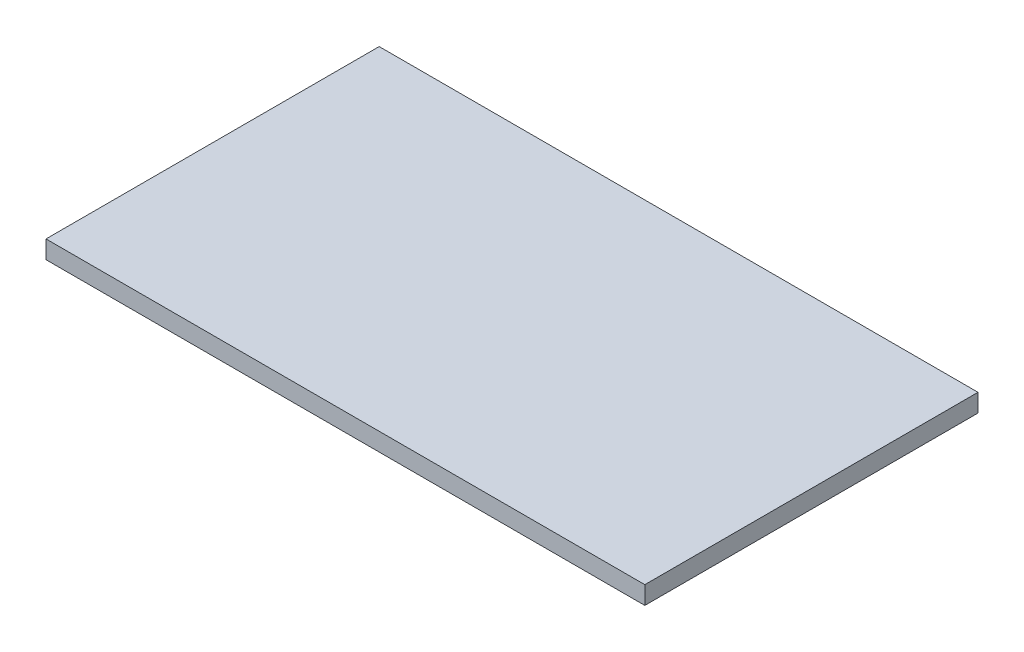
ISO-10303-21;
HEADER;
FILE_DESCRIPTION(('STEP AP214'),'2;1');
FILE_NAME('part.step','',(''),(''),'','','');
FILE_SCHEMA(('AUTOMOTIVE_DESIGN { 1 0 10303 214 1 1 1 1 }'));
ENDSEC;
DATA;
#1=APPLICATION_CONTEXT('core data for automotive mechanical design processes');
#2=APPLICATION_PROTOCOL_DEFINITION('international standard','automotive_design',2000,#1);
#3=PRODUCT_CONTEXT('',#1,'mechanical');
#4=PRODUCT('Part','Part','',(#3));
#5=PRODUCT_RELATED_PRODUCT_CATEGORY('part','',(#4));
#6=PRODUCT_DEFINITION_FORMATION('','',#4);
#7=PRODUCT_DEFINITION_CONTEXT('part definition',#1,'design');
#8=PRODUCT_DEFINITION('design','',#6,#7);
#9=PRODUCT_DEFINITION_SHAPE('','',#8);
#10=(LENGTH_UNIT() NAMED_UNIT(*) SI_UNIT(.MILLI.,.METRE.));
#11=(NAMED_UNIT(*) PLANE_ANGLE_UNIT() SI_UNIT($,.RADIAN.));
#12=(NAMED_UNIT(*) SI_UNIT($,.STERADIAN.) SOLID_ANGLE_UNIT());
#13=UNCERTAINTY_MEASURE_WITH_UNIT(LENGTH_MEASURE(1.E-05),#10,'distance_accuracy_value','');
#14=(GEOMETRIC_REPRESENTATION_CONTEXT(3) GLOBAL_UNCERTAINTY_ASSIGNED_CONTEXT((#13)) GLOBAL_UNIT_ASSIGNED_CONTEXT((#10,
#11,#12)) REPRESENTATION_CONTEXT('',''));
#15=CARTESIAN_POINT('',(0.,0.,0.));
#16=DIRECTION('',(0.,0.,1.));
#17=DIRECTION('',(1.,0.,0.));
#18=AXIS2_PLACEMENT_3D('',#15,#16,#17);
#19=CARTESIAN_POINT('',(0.,4.,0.));
#20=DIRECTION('',(1.,0.,0.));
#21=DIRECTION('',(0.,0.,-1.));
#22=AXIS2_PLACEMENT_3D('',#19,#20,#21);
#23=PLANE('',#22);
#24=DIRECTION('',(0.,0.,1.));
#25=VECTOR('',#24,1.);
#26=CARTESIAN_POINT('',(0.,0.,0.));
#27=LINE('',#26,#25);
#28=CARTESIAN_POINT('',(0.,0.,0.));
#29=VERTEX_POINT('',#28);
#30=CARTESIAN_POINT('',(0.,0.,74.));
#31=VERTEX_POINT('',#30);
#32=EDGE_CURVE('E107',#29,#31,#27,.T.);
#33=ORIENTED_EDGE('',*,*,#32,.T.);
#34=DIRECTION('',(0.,-1.,0.));
#35=VECTOR('',#34,1.);
#36=CARTESIAN_POINT('',(0.,4.,74.));
#37=LINE('',#36,#35);
#38=CARTESIAN_POINT('',(0.,4.,74.));
#39=VERTEX_POINT('',#38);
#40=EDGE_CURVE('E11',#39,#31,#37,.T.);
#41=ORIENTED_EDGE('',*,*,#40,.F.);
#42=DIRECTION('',(0.,0.,1.));
#43=VECTOR('',#42,1.);
#44=CARTESIAN_POINT('',(0.,4.,0.));
#45=LINE('',#44,#43);
#46=CARTESIAN_POINT('',(0.,4.,0.));
#47=VERTEX_POINT('',#46);
#48=EDGE_CURVE('E91',#47,#39,#45,.T.);
#49=ORIENTED_EDGE('',*,*,#48,.F.);
#50=DIRECTION('',(0.,-1.,0.));
#51=VECTOR('',#50,1.);
#52=CARTESIAN_POINT('',(0.,4.,0.));
#53=LINE('',#52,#51);
#54=EDGE_CURVE('E103',#47,#29,#53,.T.);
#55=ORIENTED_EDGE('',*,*,#54,.T.);
#56=EDGE_LOOP('',(#33,#41,#49,#55));
#57=FACE_BOUND('',#56,.T.);
#58=ADVANCED_FACE('F39',(#57),#23,.F.);
#59=CARTESIAN_POINT('',(0.,4.,74.));
#60=DIRECTION('',(0.,0.,-1.));
#61=DIRECTION('',(-1.,0.,0.));
#62=AXIS2_PLACEMENT_3D('',#59,#60,#61);
#63=PLANE('',#62);
#64=DIRECTION('',(1.,0.,0.));
#65=VECTOR('',#64,1.);
#66=CARTESIAN_POINT('',(0.,0.,74.));
#67=LINE('',#66,#65);
#68=CARTESIAN_POINT('',(133.,0.,74.));
#69=VERTEX_POINT('',#68);
#70=EDGE_CURVE('E96',#31,#69,#67,.T.);
#71=ORIENTED_EDGE('',*,*,#70,.T.);
#72=DIRECTION('',(0.,-1.,0.));
#73=VECTOR('',#72,1.);
#74=CARTESIAN_POINT('',(133.,4.,74.));
#75=LINE('',#74,#73);
#76=CARTESIAN_POINT('',(133.,4.,74.));
#77=VERTEX_POINT('',#76);
#78=EDGE_CURVE('E48',#77,#69,#75,.T.);
#79=ORIENTED_EDGE('',*,*,#78,.F.);
#80=DIRECTION('',(1.,0.,0.));
#81=VECTOR('',#80,1.);
#82=CARTESIAN_POINT('',(0.,4.,74.));
#83=LINE('',#82,#81);
#84=EDGE_CURVE('E86',#39,#77,#83,.T.);
#85=ORIENTED_EDGE('',*,*,#84,.F.);
#86=ORIENTED_EDGE('',*,*,#40,.T.);
#87=EDGE_LOOP('',(#71,#79,#85,#86));
#88=FACE_BOUND('',#87,.T.);
#89=ADVANCED_FACE('F95',(#88),#63,.F.);
#90=CARTESIAN_POINT('',(133.,4.,0.));
#91=DIRECTION('',(-1.,0.,0.));
#92=DIRECTION('',(0.,0.,1.));
#93=AXIS2_PLACEMENT_3D('',#90,#91,#92);
#94=PLANE('',#93);
#95=DIRECTION('',(0.,0.,-1.));
#96=VECTOR('',#95,1.);
#97=CARTESIAN_POINT('',(133.,0.,0.));
#98=LINE('',#97,#96);
#99=CARTESIAN_POINT('',(133.,0.,0.));
#100=VERTEX_POINT('',#99);
#101=EDGE_CURVE('E73',#69,#100,#98,.T.);
#102=ORIENTED_EDGE('',*,*,#101,.T.);
#103=DIRECTION('',(0.,-1.,0.));
#104=VECTOR('',#103,1.);
#105=CARTESIAN_POINT('',(133.,4.,0.));
#106=LINE('',#105,#104);
#107=CARTESIAN_POINT('',(133.,4.,0.));
#108=VERTEX_POINT('',#107);
#109=EDGE_CURVE('E98',#108,#100,#106,.T.);
#110=ORIENTED_EDGE('',*,*,#109,.F.);
#111=DIRECTION('',(0.,0.,-1.));
#112=VECTOR('',#111,1.);
#113=CARTESIAN_POINT('',(133.,4.,0.));
#114=LINE('',#113,#112);
#115=EDGE_CURVE('E89',#77,#108,#114,.T.);
#116=ORIENTED_EDGE('',*,*,#115,.F.);
#117=ORIENTED_EDGE('',*,*,#78,.T.);
#118=EDGE_LOOP('',(#102,#110,#116,#117));
#119=FACE_BOUND('',#118,.T.);
#120=ADVANCED_FACE('F99',(#119),#94,.F.);
#121=CARTESIAN_POINT('',(0.,4.,0.));
#122=DIRECTION('',(0.,0.,1.));
#123=DIRECTION('',(1.,0.,0.));
#124=AXIS2_PLACEMENT_3D('',#121,#122,#123);
#125=PLANE('',#124);
#126=DIRECTION('',(-1.,0.,0.));
#127=VECTOR('',#126,1.);
#128=CARTESIAN_POINT('',(0.,0.,0.));
#129=LINE('',#128,#127);
#130=EDGE_CURVE('E79',#100,#29,#129,.T.);
#131=ORIENTED_EDGE('',*,*,#130,.T.);
#132=ORIENTED_EDGE('',*,*,#54,.F.);
#133=DIRECTION('',(-1.,0.,0.));
#134=VECTOR('',#133,1.);
#135=CARTESIAN_POINT('',(0.,4.,0.));
#136=LINE('',#135,#134);
#137=EDGE_CURVE('E56',#108,#47,#136,.T.);
#138=ORIENTED_EDGE('',*,*,#137,.F.);
#139=ORIENTED_EDGE('',*,*,#109,.T.);
#140=EDGE_LOOP('',(#131,#132,#138,#139));
#141=FACE_BOUND('',#140,.T.);
#142=ADVANCED_FACE('F120',(#141),#125,.F.);
#143=CARTESIAN_POINT('',(0.,4.,0.));
#144=DIRECTION('',(0.,1.,0.));
#145=DIRECTION('',(0.,0.,1.));
#146=AXIS2_PLACEMENT_3D('',#143,#144,#145);
#147=PLANE('',#146);
#148=ORIENTED_EDGE('',*,*,#48,.T.);
#149=ORIENTED_EDGE('',*,*,#84,.T.);
#150=ORIENTED_EDGE('',*,*,#115,.T.);
#151=ORIENTED_EDGE('',*,*,#137,.T.);
#152=EDGE_LOOP('',(#148,#149,#150,#151));
#153=FACE_BOUND('',#152,.T.);
#154=ADVANCED_FACE('F87',(#153),#147,.T.);
#155=CARTESIAN_POINT('',(0.,0.,0.));
#156=DIRECTION('',(0.,1.,0.));
#157=DIRECTION('',(0.,0.,1.));
#158=AXIS2_PLACEMENT_3D('',#155,#156,#157);
#159=PLANE('',#158);
#160=ORIENTED_EDGE('',*,*,#32,.F.);
#161=ORIENTED_EDGE('',*,*,#130,.F.);
#162=ORIENTED_EDGE('',*,*,#101,.F.);
#163=ORIENTED_EDGE('',*,*,#70,.F.);
#164=EDGE_LOOP('',(#160,#161,#162,#163));
#165=FACE_BOUND('',#164,.T.);
#166=ADVANCED_FACE('F123',(#165),#159,.F.);
#167=CLOSED_SHELL('',(#58,#89,#120,#142,#154,#166));
#168=MANIFOLD_SOLID_BREP('B2',#167);
#169=ADVANCED_BREP_SHAPE_REPRESENTATION('',(#18,#168),#14);
#170=SHAPE_DEFINITION_REPRESENTATION(#9,#169);
ENDSEC;
END-ISO-10303-21;
